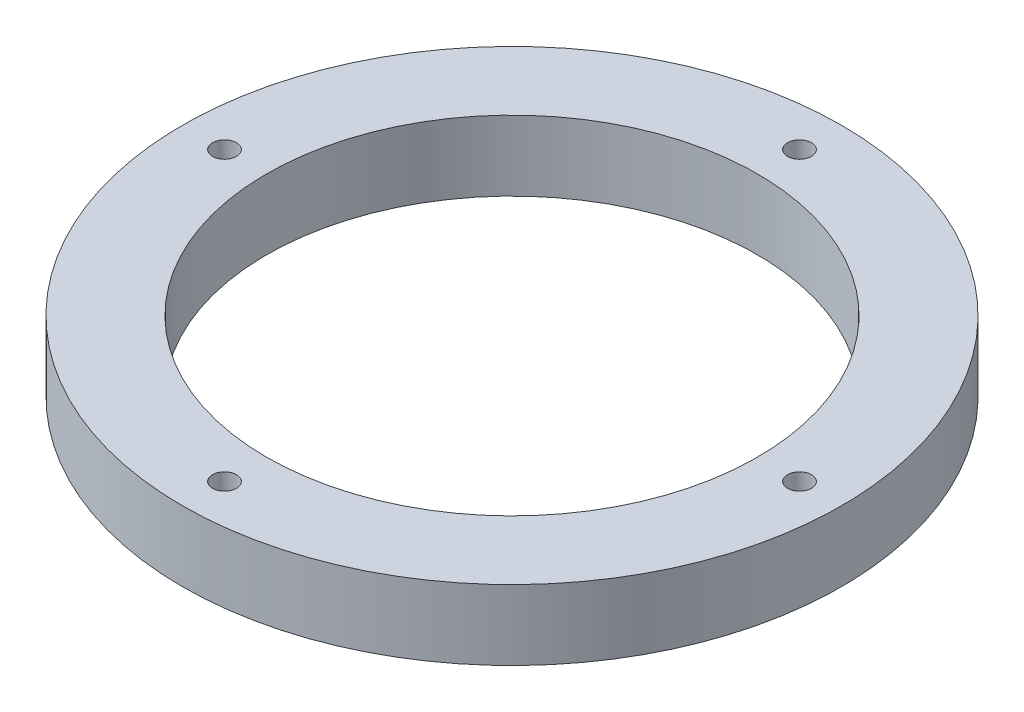
ISO-10303-21;
HEADER;
FILE_DESCRIPTION(('STEP AP214'),'2;1');
FILE_NAME('part.step','',(''),(''),'','','');
FILE_SCHEMA(('AUTOMOTIVE_DESIGN { 1 0 10303 214 1 1 1 1 }'));
ENDSEC;
DATA;
#1=APPLICATION_CONTEXT('core data for automotive mechanical design processes');
#2=APPLICATION_PROTOCOL_DEFINITION('international standard','automotive_design',2000,#1);
#3=PRODUCT_CONTEXT('',#1,'mechanical');
#4=PRODUCT('Part','Part','',(#3));
#5=PRODUCT_RELATED_PRODUCT_CATEGORY('part','',(#4));
#6=PRODUCT_DEFINITION_FORMATION('','',#4);
#7=PRODUCT_DEFINITION_CONTEXT('part definition',#1,'design');
#8=PRODUCT_DEFINITION('design','',#6,#7);
#9=PRODUCT_DEFINITION_SHAPE('','',#8);
#10=(LENGTH_UNIT() NAMED_UNIT(*) SI_UNIT(.MILLI.,.METRE.));
#11=(NAMED_UNIT(*) PLANE_ANGLE_UNIT() SI_UNIT($,.RADIAN.));
#12=(NAMED_UNIT(*) SI_UNIT($,.STERADIAN.) SOLID_ANGLE_UNIT());
#13=UNCERTAINTY_MEASURE_WITH_UNIT(LENGTH_MEASURE(1.E-05),#10,'distance_accuracy_value','');
#14=(GEOMETRIC_REPRESENTATION_CONTEXT(3) GLOBAL_UNCERTAINTY_ASSIGNED_CONTEXT((#13)) GLOBAL_UNIT_ASSIGNED_CONTEXT((#10,
#11,#12)) REPRESENTATION_CONTEXT('',''));
#15=CARTESIAN_POINT('',(0.,0.,0.));
#16=DIRECTION('',(0.,0.,1.));
#17=DIRECTION('',(1.,0.,0.));
#18=AXIS2_PLACEMENT_3D('',#15,#16,#17);
#19=CARTESIAN_POINT('',(0.,10.,0.));
#20=DIRECTION('',(0.,1.,0.));
#21=DIRECTION('',(0.,0.,1.));
#22=AXIS2_PLACEMENT_3D('',#19,#20,#21);
#23=PLANE('',#22);
#24=CARTESIAN_POINT('',(0.,10.,-41.));
#25=DIRECTION('',(0.,1.,0.));
#26=DIRECTION('',(0.,0.,1.));
#27=AXIS2_PLACEMENT_3D('',#24,#25,#26);
#28=CIRCLE('',#27,1.69999999999997);
#29=CARTESIAN_POINT('',(0.,10.,-39.3));
#30=VERTEX_POINT('',#29);
#31=EDGE_CURVE('E39',#30,#30,#28,.T.);
#32=ORIENTED_EDGE('',*,*,#31,.F.);
#33=EDGE_LOOP('',(#32));
#34=FACE_BOUND('',#33,.T.);
#35=CARTESIAN_POINT('',(41.,10.,0.));
#36=DIRECTION('',(0.,1.,0.));
#37=DIRECTION('',(0.,0.,1.));
#38=AXIS2_PLACEMENT_3D('',#35,#36,#37);
#39=CIRCLE('',#38,1.69999999999997);
#40=CARTESIAN_POINT('',(41.,10.,1.69999999999997));
#41=VERTEX_POINT('',#40);
#42=EDGE_CURVE('E62',#41,#41,#39,.T.);
#43=ORIENTED_EDGE('',*,*,#42,.F.);
#44=EDGE_LOOP('',(#43));
#45=FACE_BOUND('',#44,.T.);
#46=CARTESIAN_POINT('',(0.,10.,41.));
#47=DIRECTION('',(0.,1.,0.));
#48=DIRECTION('',(0.,0.,1.));
#49=AXIS2_PLACEMENT_3D('',#46,#47,#48);
#50=CIRCLE('',#49,1.69999999999997);
#51=CARTESIAN_POINT('',(0.,10.,42.7));
#52=VERTEX_POINT('',#51);
#53=EDGE_CURVE('E58',#52,#52,#50,.T.);
#54=ORIENTED_EDGE('',*,*,#53,.F.);
#55=EDGE_LOOP('',(#54));
#56=FACE_BOUND('',#55,.T.);
#57=CARTESIAN_POINT('',(-41.,10.,0.));
#58=DIRECTION('',(0.,1.,0.));
#59=DIRECTION('',(0.,0.,1.));
#60=AXIS2_PLACEMENT_3D('',#57,#58,#59);
#61=CIRCLE('',#60,1.69999999999997);
#62=CARTESIAN_POINT('',(-41.,10.,1.69999999999997));
#63=VERTEX_POINT('',#62);
#64=EDGE_CURVE('E54',#63,#63,#61,.T.);
#65=ORIENTED_EDGE('',*,*,#64,.F.);
#66=EDGE_LOOP('',(#65));
#67=FACE_BOUND('',#66,.T.);
#68=CARTESIAN_POINT('',(0.,10.,0.));
#69=DIRECTION('',(0.,1.,0.));
#70=DIRECTION('',(0.,0.,1.));
#71=AXIS2_PLACEMENT_3D('',#68,#69,#70);
#72=CIRCLE('',#71,47.);
#73=CARTESIAN_POINT('',(0.,10.,47.));
#74=VERTEX_POINT('',#73);
#75=EDGE_CURVE('E10',#74,#74,#72,.T.);
#76=ORIENTED_EDGE('',*,*,#75,.T.);
#77=EDGE_LOOP('',(#76));
#78=FACE_BOUND('',#77,.T.);
#79=CARTESIAN_POINT('',(0.,10.,0.));
#80=DIRECTION('',(0.,1.,0.));
#81=DIRECTION('',(0.,0.,1.));
#82=AXIS2_PLACEMENT_3D('',#79,#80,#81);
#83=CIRCLE('',#82,35.);
#84=CARTESIAN_POINT('',(0.,10.,35.));
#85=VERTEX_POINT('',#84);
#86=EDGE_CURVE('E48',#85,#85,#83,.T.);
#87=ORIENTED_EDGE('',*,*,#86,.F.);
#88=EDGE_LOOP('',(#87));
#89=FACE_BOUND('',#88,.T.);
#90=ADVANCED_FACE('F35',(#34,#45,#56,#67,#78,#89),#23,.T.);
#91=CARTESIAN_POINT('',(0.,0.,0.));
#92=DIRECTION('',(0.,1.,0.));
#93=DIRECTION('',(0.,0.,1.));
#94=AXIS2_PLACEMENT_3D('',#91,#92,#93);
#95=PLANE('',#94);
#96=CARTESIAN_POINT('',(0.,0.,-41.));
#97=DIRECTION('',(0.,-1.,0.));
#98=DIRECTION('',(0.,0.,-1.));
#99=AXIS2_PLACEMENT_3D('',#96,#97,#98);
#100=CIRCLE('',#99,3.15);
#101=CARTESIAN_POINT('',(0.,0.,-44.15));
#102=VERTEX_POINT('',#101);
#103=EDGE_CURVE('E163',#102,#102,#100,.T.);
#104=ORIENTED_EDGE('',*,*,#103,.F.);
#105=EDGE_LOOP('',(#104));
#106=FACE_BOUND('',#105,.T.);
#107=CARTESIAN_POINT('',(41.,0.,0.));
#108=DIRECTION('',(0.,-1.,0.));
#109=DIRECTION('',(0.,0.,-1.));
#110=AXIS2_PLACEMENT_3D('',#107,#108,#109);
#111=CIRCLE('',#110,3.15);
#112=CARTESIAN_POINT('',(41.,0.,-3.15));
#113=VERTEX_POINT('',#112);
#114=EDGE_CURVE('E71',#113,#113,#111,.T.);
#115=ORIENTED_EDGE('',*,*,#114,.F.);
#116=EDGE_LOOP('',(#115));
#117=FACE_BOUND('',#116,.T.);
#118=CARTESIAN_POINT('',(0.,0.,41.));
#119=DIRECTION('',(0.,-1.,0.));
#120=DIRECTION('',(0.,0.,-1.));
#121=AXIS2_PLACEMENT_3D('',#118,#119,#120);
#122=CIRCLE('',#121,3.15);
#123=CARTESIAN_POINT('',(0.,0.,37.85));
#124=VERTEX_POINT('',#123);
#125=EDGE_CURVE('E64',#124,#124,#122,.T.);
#126=ORIENTED_EDGE('',*,*,#125,.F.);
#127=EDGE_LOOP('',(#126));
#128=FACE_BOUND('',#127,.T.);
#129=CARTESIAN_POINT('',(-41.,0.,0.));
#130=DIRECTION('',(0.,-1.,0.));
#131=DIRECTION('',(0.,0.,-1.));
#132=AXIS2_PLACEMENT_3D('',#129,#130,#131);
#133=CIRCLE('',#132,3.15);
#134=CARTESIAN_POINT('',(-41.,0.,-3.15));
#135=VERTEX_POINT('',#134);
#136=EDGE_CURVE('E60',#135,#135,#133,.T.);
#137=ORIENTED_EDGE('',*,*,#136,.F.);
#138=EDGE_LOOP('',(#137));
#139=FACE_BOUND('',#138,.T.);
#140=CARTESIAN_POINT('',(0.,0.,0.));
#141=DIRECTION('',(0.,1.,0.));
#142=DIRECTION('',(0.,0.,1.));
#143=AXIS2_PLACEMENT_3D('',#140,#141,#142);
#144=CIRCLE('',#143,47.);
#145=CARTESIAN_POINT('',(0.,0.,47.));
#146=VERTEX_POINT('',#145);
#147=EDGE_CURVE('E43',#146,#146,#144,.T.);
#148=ORIENTED_EDGE('',*,*,#147,.F.);
#149=EDGE_LOOP('',(#148));
#150=FACE_BOUND('',#149,.T.);
#151=CARTESIAN_POINT('',(0.,0.,0.));
#152=DIRECTION('',(0.,1.,0.));
#153=DIRECTION('',(0.,0.,1.));
#154=AXIS2_PLACEMENT_3D('',#151,#152,#153);
#155=CIRCLE('',#154,35.);
#156=CARTESIAN_POINT('',(0.,0.,35.));
#157=VERTEX_POINT('',#156);
#158=EDGE_CURVE('E51',#157,#157,#155,.T.);
#159=ORIENTED_EDGE('',*,*,#158,.T.);
#160=EDGE_LOOP('',(#159));
#161=FACE_BOUND('',#160,.T.);
#162=ADVANCED_FACE('F90',(#106,#117,#128,#139,#150,#161),#95,.F.);
#163=CARTESIAN_POINT('',(0.,10.,0.));
#164=DIRECTION('',(0.,-1.,0.));
#165=DIRECTION('',(0.,0.,-1.));
#166=AXIS2_PLACEMENT_3D('',#163,#164,#165);
#167=CYLINDRICAL_SURFACE('',#166,47.);
#168=ORIENTED_EDGE('',*,*,#75,.F.);
#169=EDGE_LOOP('',(#168));
#170=FACE_BOUND('',#169,.T.);
#171=ORIENTED_EDGE('',*,*,#147,.T.);
#172=EDGE_LOOP('',(#171));
#173=FACE_BOUND('',#172,.T.);
#174=ADVANCED_FACE('F37',(#170,#173),#167,.T.);
#175=CARTESIAN_POINT('',(0.,10.,0.));
#176=DIRECTION('',(0.,-1.,0.));
#177=DIRECTION('',(0.,0.,-1.));
#178=AXIS2_PLACEMENT_3D('',#175,#176,#177);
#179=CYLINDRICAL_SURFACE('',#178,35.);
#180=ORIENTED_EDGE('',*,*,#86,.T.);
#181=EDGE_LOOP('',(#180));
#182=FACE_BOUND('',#181,.T.);
#183=ORIENTED_EDGE('',*,*,#158,.F.);
#184=EDGE_LOOP('',(#183));
#185=FACE_BOUND('',#184,.T.);
#186=ADVANCED_FACE('F92',(#182,#185),#179,.F.);
#187=CARTESIAN_POINT('',(-41.,0.,0.));
#188=DIRECTION('',(0.,-1.,0.));
#189=DIRECTION('',(0.,0.,-1.));
#190=AXIS2_PLACEMENT_3D('',#187,#188,#189);
#191=CYLINDRICAL_SURFACE('',#190,1.69999999999997);
#192=ORIENTED_EDGE('',*,*,#64,.T.);
#193=EDGE_LOOP('',(#192));
#194=FACE_BOUND('',#193,.T.);
#195=CARTESIAN_POINT('',(-41.,1.45000000000001,0.));
#196=DIRECTION('',(0.,-1.,0.));
#197=DIRECTION('',(0.,0.,-1.));
#198=AXIS2_PLACEMENT_3D('',#195,#196,#197);
#199=CIRCLE('',#198,1.69999999999998);
#200=CARTESIAN_POINT('',(-41.,1.45000000000001,-1.69999999999998));
#201=VERTEX_POINT('',#200);
#202=EDGE_CURVE('E57',#201,#201,#199,.T.);
#203=ORIENTED_EDGE('',*,*,#202,.T.);
#204=EDGE_LOOP('',(#203));
#205=FACE_BOUND('',#204,.T.);
#206=ADVANCED_FACE('F94',(#194,#205),#191,.F.);
#207=CARTESIAN_POINT('',(-41.,0.,0.));
#208=DIRECTION('',(0.,-1.,0.));
#209=DIRECTION('',(0.,0.,-1.));
#210=AXIS2_PLACEMENT_3D('',#207,#208,#209);
#211=CONICAL_SURFACE('',#210,3.15,0.785398163397452);
#212=ORIENTED_EDGE('',*,*,#202,.F.);
#213=EDGE_LOOP('',(#212));
#214=FACE_BOUND('',#213,.T.);
#215=ORIENTED_EDGE('',*,*,#136,.T.);
#216=EDGE_LOOP('',(#215));
#217=FACE_BOUND('',#216,.T.);
#218=ADVANCED_FACE('F100',(#214,#217),#211,.F.);
#219=CARTESIAN_POINT('',(0.,0.,41.));
#220=DIRECTION('',(0.,-1.,0.));
#221=DIRECTION('',(0.,0.,-1.));
#222=AXIS2_PLACEMENT_3D('',#219,#220,#221);
#223=CYLINDRICAL_SURFACE('',#222,1.69999999999997);
#224=ORIENTED_EDGE('',*,*,#53,.T.);
#225=EDGE_LOOP('',(#224));
#226=FACE_BOUND('',#225,.T.);
#227=CARTESIAN_POINT('',(0.,1.45000000000001,41.));
#228=DIRECTION('',(0.,-1.,0.));
#229=DIRECTION('',(0.,0.,-1.));
#230=AXIS2_PLACEMENT_3D('',#227,#228,#229);
#231=CIRCLE('',#230,1.69999999999998);
#232=CARTESIAN_POINT('',(0.,1.45000000000001,39.3));
#233=VERTEX_POINT('',#232);
#234=EDGE_CURVE('E61',#233,#233,#231,.T.);
#235=ORIENTED_EDGE('',*,*,#234,.T.);
#236=EDGE_LOOP('',(#235));
#237=FACE_BOUND('',#236,.T.);
#238=ADVANCED_FACE('F124',(#226,#237),#223,.F.);
#239=CARTESIAN_POINT('',(0.,0.,41.));
#240=DIRECTION('',(0.,-1.,0.));
#241=DIRECTION('',(0.,0.,-1.));
#242=AXIS2_PLACEMENT_3D('',#239,#240,#241);
#243=CONICAL_SURFACE('',#242,3.15,0.785398163397453);
#244=ORIENTED_EDGE('',*,*,#234,.F.);
#245=EDGE_LOOP('',(#244));
#246=FACE_BOUND('',#245,.T.);
#247=ORIENTED_EDGE('',*,*,#125,.T.);
#248=EDGE_LOOP('',(#247));
#249=FACE_BOUND('',#248,.T.);
#250=ADVANCED_FACE('F134',(#246,#249),#243,.F.);
#251=CARTESIAN_POINT('',(41.,0.,0.));
#252=DIRECTION('',(0.,-1.,0.));
#253=DIRECTION('',(0.,0.,-1.));
#254=AXIS2_PLACEMENT_3D('',#251,#252,#253);
#255=CYLINDRICAL_SURFACE('',#254,1.69999999999997);
#256=ORIENTED_EDGE('',*,*,#42,.T.);
#257=EDGE_LOOP('',(#256));
#258=FACE_BOUND('',#257,.T.);
#259=CARTESIAN_POINT('',(41.,1.45000000000001,0.));
#260=DIRECTION('',(0.,-1.,0.));
#261=DIRECTION('',(0.,0.,-1.));
#262=AXIS2_PLACEMENT_3D('',#259,#260,#261);
#263=CIRCLE('',#262,1.69999999999998);
#264=CARTESIAN_POINT('',(41.,1.45000000000001,-1.69999999999998));
#265=VERTEX_POINT('',#264);
#266=EDGE_CURVE('E65',#265,#265,#263,.T.);
#267=ORIENTED_EDGE('',*,*,#266,.T.);
#268=EDGE_LOOP('',(#267));
#269=FACE_BOUND('',#268,.T.);
#270=ADVANCED_FACE('F140',(#258,#269),#255,.F.);
#271=CARTESIAN_POINT('',(41.,0.,0.));
#272=DIRECTION('',(0.,-1.,0.));
#273=DIRECTION('',(0.,0.,-1.));
#274=AXIS2_PLACEMENT_3D('',#271,#272,#273);
#275=CONICAL_SURFACE('',#274,3.15,0.785398163397452);
#276=ORIENTED_EDGE('',*,*,#266,.F.);
#277=EDGE_LOOP('',(#276));
#278=FACE_BOUND('',#277,.T.);
#279=ORIENTED_EDGE('',*,*,#114,.T.);
#280=EDGE_LOOP('',(#279));
#281=FACE_BOUND('',#280,.T.);
#282=ADVANCED_FACE('F144',(#278,#281),#275,.F.);
#283=CARTESIAN_POINT('',(0.,0.,-41.));
#284=DIRECTION('',(0.,-1.,0.));
#285=DIRECTION('',(0.,0.,-1.));
#286=AXIS2_PLACEMENT_3D('',#283,#284,#285);
#287=CYLINDRICAL_SURFACE('',#286,1.69999999999997);
#288=ORIENTED_EDGE('',*,*,#31,.T.);
#289=EDGE_LOOP('',(#288));
#290=FACE_BOUND('',#289,.T.);
#291=CARTESIAN_POINT('',(0.,1.45000000000001,-41.));
#292=DIRECTION('',(0.,-1.,0.));
#293=DIRECTION('',(0.,0.,-1.));
#294=AXIS2_PLACEMENT_3D('',#291,#292,#293);
#295=CIRCLE('',#294,1.69999999999998);
#296=CARTESIAN_POINT('',(0.,1.45000000000001,-42.7));
#297=VERTEX_POINT('',#296);
#298=EDGE_CURVE('E160',#297,#297,#295,.T.);
#299=ORIENTED_EDGE('',*,*,#298,.T.);
#300=EDGE_LOOP('',(#299));
#301=FACE_BOUND('',#300,.T.);
#302=ADVANCED_FACE('F147',(#290,#301),#287,.F.);
#303=CARTESIAN_POINT('',(0.,0.,-41.));
#304=DIRECTION('',(0.,-1.,0.));
#305=DIRECTION('',(0.,0.,-1.));
#306=AXIS2_PLACEMENT_3D('',#303,#304,#305);
#307=CONICAL_SURFACE('',#306,3.15,0.785398163397453);
#308=ORIENTED_EDGE('',*,*,#298,.F.);
#309=EDGE_LOOP('',(#308));
#310=FACE_BOUND('',#309,.T.);
#311=ORIENTED_EDGE('',*,*,#103,.T.);
#312=EDGE_LOOP('',(#311));
#313=FACE_BOUND('',#312,.T.);
#314=ADVANCED_FACE('F151',(#310,#313),#307,.F.);
#315=CLOSED_SHELL('',(#90,#162,#174,#186,#206,#218,#238,#250,#270,#282,#302,#314));
#316=MANIFOLD_SOLID_BREP('B2',#315);
#317=ADVANCED_BREP_SHAPE_REPRESENTATION('',(#18,#316),#14);
#318=SHAPE_DEFINITION_REPRESENTATION(#9,#317);
ENDSEC;
END-ISO-10303-21;
